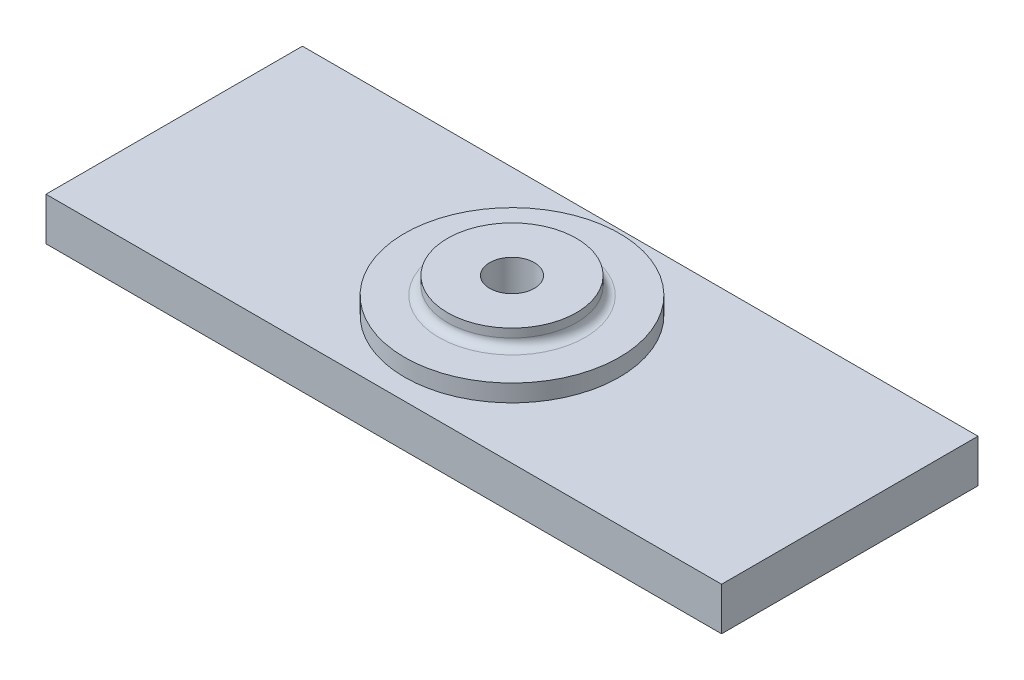
ISO-10303-21;
HEADER;
FILE_DESCRIPTION(('STEP AP214'),'2;1');
FILE_NAME('part.step','',(''),(''),'','','');
FILE_SCHEMA(('AUTOMOTIVE_DESIGN { 1 0 10303 214 1 1 1 1 }'));
ENDSEC;
DATA;
#1=APPLICATION_CONTEXT('core data for automotive mechanical design processes');
#2=APPLICATION_PROTOCOL_DEFINITION('international standard','automotive_design',2000,#1);
#3=PRODUCT_CONTEXT('',#1,'mechanical');
#4=PRODUCT('Part','Part','',(#3));
#5=PRODUCT_RELATED_PRODUCT_CATEGORY('part','',(#4));
#6=PRODUCT_DEFINITION_FORMATION('','',#4);
#7=PRODUCT_DEFINITION_CONTEXT('part definition',#1,'design');
#8=PRODUCT_DEFINITION('design','',#6,#7);
#9=PRODUCT_DEFINITION_SHAPE('','',#8);
#10=(LENGTH_UNIT() NAMED_UNIT(*) SI_UNIT(.MILLI.,.METRE.));
#11=(NAMED_UNIT(*) PLANE_ANGLE_UNIT() SI_UNIT($,.RADIAN.));
#12=(NAMED_UNIT(*) SI_UNIT($,.STERADIAN.) SOLID_ANGLE_UNIT());
#13=UNCERTAINTY_MEASURE_WITH_UNIT(LENGTH_MEASURE(1.E-05),#10,'distance_accuracy_value','');
#14=(GEOMETRIC_REPRESENTATION_CONTEXT(3) GLOBAL_UNCERTAINTY_ASSIGNED_CONTEXT((#13)) GLOBAL_UNIT_ASSIGNED_CONTEXT((#10,
#11,#12)) REPRESENTATION_CONTEXT('',''));
#15=CARTESIAN_POINT('',(0.,0.,0.));
#16=DIRECTION('',(0.,0.,1.));
#17=DIRECTION('',(1.,0.,0.));
#18=AXIS2_PLACEMENT_3D('',#15,#16,#17);
#19=CARTESIAN_POINT('',(0.,2.,0.));
#20=DIRECTION('',(0.,-1.,0.));
#21=DIRECTION('',(0.,0.,-1.));
#22=AXIS2_PLACEMENT_3D('',#19,#20,#21);
#23=CYLINDRICAL_SURFACE('',#22,12.5);
#24=CARTESIAN_POINT('',(0.,2.,0.));
#25=DIRECTION('',(0.,1.,0.));
#26=DIRECTION('',(0.,0.,1.));
#27=AXIS2_PLACEMENT_3D('',#24,#25,#26);
#28=CIRCLE('',#27,12.5);
#29=CARTESIAN_POINT('',(0.,2.,12.5));
#30=VERTEX_POINT('',#29);
#31=EDGE_CURVE('E123',#30,#30,#28,.T.);
#32=ORIENTED_EDGE('',*,*,#31,.F.);
#33=EDGE_LOOP('',(#32));
#34=FACE_BOUND('',#33,.T.);
#35=CARTESIAN_POINT('',(0.,0.,0.));
#36=DIRECTION('',(0.,1.,0.));
#37=DIRECTION('',(0.,0.,1.));
#38=AXIS2_PLACEMENT_3D('',#35,#36,#37);
#39=CIRCLE('',#38,12.5);
#40=CARTESIAN_POINT('',(0.,0.,12.5));
#41=VERTEX_POINT('',#40);
#42=EDGE_CURVE('E111',#41,#41,#39,.T.);
#43=ORIENTED_EDGE('',*,*,#42,.T.);
#44=EDGE_LOOP('',(#43));
#45=FACE_BOUND('',#44,.T.);
#46=ADVANCED_FACE('F34',(#34,#45),#23,.T.);
#47=CARTESIAN_POINT('',(0.,2.,0.));
#48=DIRECTION('',(0.,1.,0.));
#49=DIRECTION('',(0.,0.,1.));
#50=AXIS2_PLACEMENT_3D('',#47,#48,#49);
#51=PLANE('',#50);
#52=CARTESIAN_POINT('',(0.,2.,0.));
#53=DIRECTION('',(0.,1.,0.));
#54=DIRECTION('',(0.,0.,1.));
#55=AXIS2_PLACEMENT_3D('',#52,#53,#54);
#56=CIRCLE('',#55,8.5);
#57=CARTESIAN_POINT('',(0.,2.,8.5));
#58=VERTEX_POINT('',#57);
#59=EDGE_CURVE('E11',#58,#58,#56,.F.);
#60=ORIENTED_EDGE('',*,*,#59,.T.);
#61=EDGE_LOOP('',(#60));
#62=FACE_BOUND('',#61,.T.);
#63=ORIENTED_EDGE('',*,*,#31,.T.);
#64=EDGE_LOOP('',(#63));
#65=FACE_BOUND('',#64,.T.);
#66=ADVANCED_FACE('F148',(#62,#65),#51,.T.);
#67=CARTESIAN_POINT('',(0.,4.,0.));
#68=DIRECTION('',(0.,-1.,0.));
#69=DIRECTION('',(0.,0.,-1.));
#70=AXIS2_PLACEMENT_3D('',#67,#68,#69);
#71=CYLINDRICAL_SURFACE('',#70,7.5);
#72=CARTESIAN_POINT('',(0.,3.,0.));
#73=DIRECTION('',(0.,1.,0.));
#74=DIRECTION('',(0.,0.,1.));
#75=AXIS2_PLACEMENT_3D('',#72,#73,#74);
#76=CIRCLE('',#75,7.5);
#77=CARTESIAN_POINT('',(0.,3.,7.5));
#78=VERTEX_POINT('',#77);
#79=EDGE_CURVE('E43',#78,#78,#76,.T.);
#80=ORIENTED_EDGE('',*,*,#79,.T.);
#81=EDGE_LOOP('',(#80));
#82=FACE_BOUND('',#81,.T.);
#83=CARTESIAN_POINT('',(0.,4.,0.));
#84=DIRECTION('',(0.,1.,0.));
#85=DIRECTION('',(0.,0.,1.));
#86=AXIS2_PLACEMENT_3D('',#83,#84,#85);
#87=CIRCLE('',#86,7.5);
#88=CARTESIAN_POINT('',(0.,4.,7.5));
#89=VERTEX_POINT('',#88);
#90=EDGE_CURVE('E117',#89,#89,#87,.T.);
#91=ORIENTED_EDGE('',*,*,#90,.F.);
#92=EDGE_LOOP('',(#91));
#93=FACE_BOUND('',#92,.T.);
#94=ADVANCED_FACE('F130',(#82,#93),#71,.T.);
#95=CARTESIAN_POINT('',(0.,4.,0.));
#96=DIRECTION('',(0.,1.,0.));
#97=DIRECTION('',(0.,0.,1.));
#98=AXIS2_PLACEMENT_3D('',#95,#96,#97);
#99=PLANE('',#98);
#100=CARTESIAN_POINT('',(0.,4.,0.));
#101=DIRECTION('',(0.,1.,0.));
#102=DIRECTION('',(0.,0.,1.));
#103=AXIS2_PLACEMENT_3D('',#100,#101,#102);
#104=CIRCLE('',#103,2.6);
#105=CARTESIAN_POINT('',(0.,4.,2.6));
#106=VERTEX_POINT('',#105);
#107=EDGE_CURVE('E114',#106,#106,#104,.T.);
#108=ORIENTED_EDGE('',*,*,#107,.F.);
#109=EDGE_LOOP('',(#108));
#110=FACE_BOUND('',#109,.T.);
#111=ORIENTED_EDGE('',*,*,#90,.T.);
#112=EDGE_LOOP('',(#111));
#113=FACE_BOUND('',#112,.T.);
#114=ADVANCED_FACE('F135',(#110,#113),#99,.T.);
#115=CARTESIAN_POINT('',(0.,3.,0.));
#116=DIRECTION('',(0.,1.,0.));
#117=DIRECTION('',(0.,0.,1.));
#118=AXIS2_PLACEMENT_3D('',#115,#116,#117);
#119=TOROIDAL_SURFACE('',#118,8.5,1.);
#120=ORIENTED_EDGE('',*,*,#59,.F.);
#121=EDGE_LOOP('',(#120));
#122=FACE_BOUND('',#121,.T.);
#123=ORIENTED_EDGE('',*,*,#79,.F.);
#124=EDGE_LOOP('',(#123));
#125=FACE_BOUND('',#124,.T.);
#126=ADVANCED_FACE('F36',(#122,#125),#119,.F.);
#127=CARTESIAN_POINT('',(0.,-0.00100000000000013,0.));
#128=DIRECTION('',(0.,1.,0.));
#129=DIRECTION('',(0.,0.,1.));
#130=AXIS2_PLACEMENT_3D('',#127,#128,#129);
#131=CYLINDRICAL_SURFACE('',#130,2.6);
#132=ORIENTED_EDGE('',*,*,#107,.T.);
#133=EDGE_LOOP('',(#132));
#134=FACE_BOUND('',#133,.T.);
#135=CARTESIAN_POINT('',(0.,0.,0.));
#136=DIRECTION('',(0.,1.,0.));
#137=DIRECTION('',(0.,0.,1.));
#138=AXIS2_PLACEMENT_3D('',#135,#136,#137);
#139=CIRCLE('',#138,2.6);
#140=CARTESIAN_POINT('',(0.,0.,2.6));
#141=VERTEX_POINT('',#140);
#142=EDGE_CURVE('E118',#141,#141,#139,.F.);
#143=ORIENTED_EDGE('',*,*,#142,.T.);
#144=EDGE_LOOP('',(#143));
#145=FACE_BOUND('',#144,.T.);
#146=ADVANCED_FACE('F134',(#134,#145),#131,.F.);
#147=CARTESIAN_POINT('',(0.,0.,0.));
#148=DIRECTION('',(0.,-1.,0.));
#149=DIRECTION('',(0.,0.,-1.));
#150=AXIS2_PLACEMENT_3D('',#147,#148,#149);
#151=PLANE('',#150);
#152=ORIENTED_EDGE('',*,*,#42,.F.);
#153=EDGE_LOOP('',(#152));
#154=FACE_BOUND('',#153,.T.);
#155=DIRECTION('',(0.,0.,-1.));
#156=VECTOR('',#155,1.);
#157=CARTESIAN_POINT('',(39.3042691229159,0.,14.9195797078823));
#158=LINE('',#157,#156);
#159=CARTESIAN_POINT('',(39.3042691229159,0.,14.9195797078823));
#160=VERTEX_POINT('',#159);
#161=CARTESIAN_POINT('',(39.3042691229159,0.,-14.9195797078823));
#162=VERTEX_POINT('',#161);
#163=EDGE_CURVE('E102',#160,#162,#158,.T.);
#164=ORIENTED_EDGE('',*,*,#163,.T.);
#165=DIRECTION('',(-1.,0.,0.));
#166=VECTOR('',#165,1.);
#167=CARTESIAN_POINT('',(-39.3042691229159,0.,-14.9195797078823));
#168=LINE('',#167,#166);
#169=CARTESIAN_POINT('',(-39.3042691229159,0.,-14.9195797078823));
#170=VERTEX_POINT('',#169);
#171=EDGE_CURVE('E105',#162,#170,#168,.T.);
#172=ORIENTED_EDGE('',*,*,#171,.T.);
#173=DIRECTION('',(0.,0.,1.));
#174=VECTOR('',#173,1.);
#175=CARTESIAN_POINT('',(-39.3042691229159,0.,14.9195797078823));
#176=LINE('',#175,#174);
#177=CARTESIAN_POINT('',(-39.3042691229159,0.,14.9195797078823));
#178=VERTEX_POINT('',#177);
#179=EDGE_CURVE('E87',#170,#178,#176,.T.);
#180=ORIENTED_EDGE('',*,*,#179,.T.);
#181=DIRECTION('',(1.,0.,0.));
#182=VECTOR('',#181,1.);
#183=CARTESIAN_POINT('',(-39.3042691229159,0.,14.9195797078823));
#184=LINE('',#183,#182);
#185=EDGE_CURVE('E98',#178,#160,#184,.T.);
#186=ORIENTED_EDGE('',*,*,#185,.T.);
#187=EDGE_LOOP('',(#164,#172,#180,#186));
#188=FACE_BOUND('',#187,.T.);
#189=ADVANCED_FACE('F141',(#154,#188),#151,.F.);
#190=CARTESIAN_POINT('',(0.,-5.,0.));
#191=DIRECTION('',(0.,-1.,0.));
#192=DIRECTION('',(0.,0.,-1.));
#193=AXIS2_PLACEMENT_3D('',#190,#191,#192);
#194=PLANE('',#193);
#195=DIRECTION('',(0.,0.,-1.));
#196=VECTOR('',#195,1.);
#197=CARTESIAN_POINT('',(39.3042691229159,-5.,14.9195797078823));
#198=LINE('',#197,#196);
#199=CARTESIAN_POINT('',(39.3042691229159,-5.,14.9195797078823));
#200=VERTEX_POINT('',#199);
#201=CARTESIAN_POINT('',(39.3042691229159,-5.,-14.9195797078823));
#202=VERTEX_POINT('',#201);
#203=EDGE_CURVE('E96',#200,#202,#198,.T.);
#204=ORIENTED_EDGE('',*,*,#203,.F.);
#205=DIRECTION('',(1.,0.,0.));
#206=VECTOR('',#205,1.);
#207=CARTESIAN_POINT('',(-39.3042691229159,-5.,14.9195797078823));
#208=LINE('',#207,#206);
#209=CARTESIAN_POINT('',(-39.3042691229159,-5.,14.9195797078823));
#210=VERTEX_POINT('',#209);
#211=EDGE_CURVE('E93',#210,#200,#208,.T.);
#212=ORIENTED_EDGE('',*,*,#211,.F.);
#213=DIRECTION('',(0.,0.,1.));
#214=VECTOR('',#213,1.);
#215=CARTESIAN_POINT('',(-39.3042691229159,-5.,14.9195797078823));
#216=LINE('',#215,#214);
#217=CARTESIAN_POINT('',(-39.3042691229159,-5.,-14.9195797078823));
#218=VERTEX_POINT('',#217);
#219=EDGE_CURVE('E85',#218,#210,#216,.T.);
#220=ORIENTED_EDGE('',*,*,#219,.F.);
#221=DIRECTION('',(-1.,0.,0.));
#222=VECTOR('',#221,1.);
#223=CARTESIAN_POINT('',(-39.3042691229159,-5.,-14.9195797078823));
#224=LINE('',#223,#222);
#225=EDGE_CURVE('E92',#202,#218,#224,.T.);
#226=ORIENTED_EDGE('',*,*,#225,.F.);
#227=EDGE_LOOP('',(#204,#212,#220,#226));
#228=FACE_BOUND('',#227,.T.);
#229=ADVANCED_FACE('F91',(#228),#194,.T.);
#230=CARTESIAN_POINT('',(-39.3042691229159,-5.,-14.9195797078823));
#231=DIRECTION('',(0.,0.,-1.));
#232=DIRECTION('',(-1.,0.,0.));
#233=AXIS2_PLACEMENT_3D('',#230,#231,#232);
#234=PLANE('',#233);
#235=ORIENTED_EDGE('',*,*,#171,.F.);
#236=DIRECTION('',(0.,1.,0.));
#237=VECTOR('',#236,1.);
#238=CARTESIAN_POINT('',(39.3042691229159,-5.,-14.9195797078823));
#239=LINE('',#238,#237);
#240=EDGE_CURVE('E79',#202,#162,#239,.T.);
#241=ORIENTED_EDGE('',*,*,#240,.F.);
#242=ORIENTED_EDGE('',*,*,#225,.T.);
#243=DIRECTION('',(0.,1.,0.));
#244=VECTOR('',#243,1.);
#245=CARTESIAN_POINT('',(-39.3042691229159,-5.,-14.9195797078823));
#246=LINE('',#245,#244);
#247=EDGE_CURVE('E82',#218,#170,#246,.T.);
#248=ORIENTED_EDGE('',*,*,#247,.T.);
#249=EDGE_LOOP('',(#235,#241,#242,#248));
#250=FACE_BOUND('',#249,.T.);
#251=ADVANCED_FACE('F95',(#250),#234,.T.);
#252=CARTESIAN_POINT('',(-39.3042691229159,-5.,14.9195797078823));
#253=DIRECTION('',(-1.,0.,0.));
#254=DIRECTION('',(0.,0.,1.));
#255=AXIS2_PLACEMENT_3D('',#252,#253,#254);
#256=PLANE('',#255);
#257=ORIENTED_EDGE('',*,*,#179,.F.);
#258=ORIENTED_EDGE('',*,*,#247,.F.);
#259=ORIENTED_EDGE('',*,*,#219,.T.);
#260=DIRECTION('',(0.,1.,0.));
#261=VECTOR('',#260,1.);
#262=CARTESIAN_POINT('',(-39.3042691229159,-5.,14.9195797078823));
#263=LINE('',#262,#261);
#264=EDGE_CURVE('E68',#210,#178,#263,.T.);
#265=ORIENTED_EDGE('',*,*,#264,.T.);
#266=EDGE_LOOP('',(#257,#258,#259,#265));
#267=FACE_BOUND('',#266,.T.);
#268=ADVANCED_FACE('F84',(#267),#256,.T.);
#269=CARTESIAN_POINT('',(-39.3042691229159,-5.,14.9195797078823));
#270=DIRECTION('',(0.,0.,1.));
#271=DIRECTION('',(1.,0.,0.));
#272=AXIS2_PLACEMENT_3D('',#269,#270,#271);
#273=PLANE('',#272);
#274=ORIENTED_EDGE('',*,*,#185,.F.);
#275=ORIENTED_EDGE('',*,*,#264,.F.);
#276=ORIENTED_EDGE('',*,*,#211,.T.);
#277=DIRECTION('',(0.,1.,0.));
#278=VECTOR('',#277,1.);
#279=CARTESIAN_POINT('',(39.3042691229159,-5.,14.9195797078823));
#280=LINE('',#279,#278);
#281=EDGE_CURVE('E51',#200,#160,#280,.T.);
#282=ORIENTED_EDGE('',*,*,#281,.T.);
#283=EDGE_LOOP('',(#274,#275,#276,#282));
#284=FACE_BOUND('',#283,.T.);
#285=ADVANCED_FACE('F164',(#284),#273,.T.);
#286=CARTESIAN_POINT('',(39.3042691229159,-5.,14.9195797078823));
#287=DIRECTION('',(1.,0.,0.));
#288=DIRECTION('',(0.,0.,-1.));
#289=AXIS2_PLACEMENT_3D('',#286,#287,#288);
#290=PLANE('',#289);
#291=ORIENTED_EDGE('',*,*,#163,.F.);
#292=ORIENTED_EDGE('',*,*,#281,.F.);
#293=ORIENTED_EDGE('',*,*,#203,.T.);
#294=ORIENTED_EDGE('',*,*,#240,.T.);
#295=EDGE_LOOP('',(#291,#292,#293,#294));
#296=FACE_BOUND('',#295,.T.);
#297=ADVANCED_FACE('F160',(#296),#290,.T.);
#298=ORIENTED_EDGE('',*,*,#142,.F.);
#299=EDGE_LOOP('',(#298));
#300=FACE_BOUND('',#299,.T.);
#301=ADVANCED_FACE('F163',(#300),#151,.F.);
#302=CLOSED_SHELL('',(#46,#66,#94,#114,#126,#146,#189,#229,#251,#268,#285,#297,#301));
#303=MANIFOLD_SOLID_BREP('B2',#302);
#304=ADVANCED_BREP_SHAPE_REPRESENTATION('',(#18,#303),#14);
#305=SHAPE_DEFINITION_REPRESENTATION(#9,#304);
ENDSEC;
END-ISO-10303-21;
